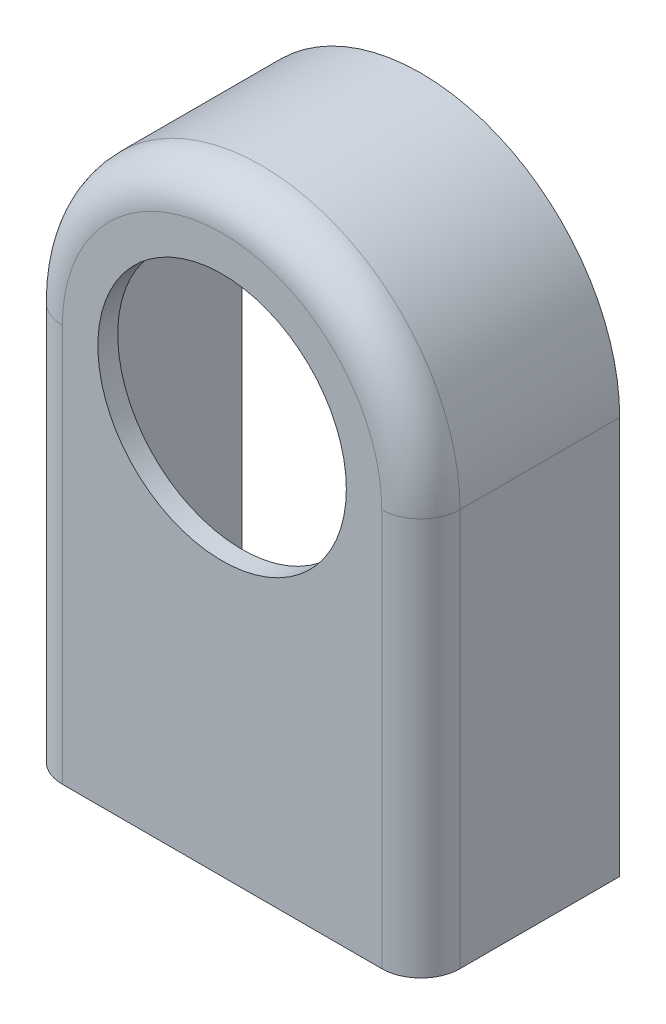
ISO-10303-21;
HEADER;
FILE_DESCRIPTION(('STEP AP214'),'2;1');
FILE_NAME('part.step','',(''),(''),'','','');
FILE_SCHEMA(('AUTOMOTIVE_DESIGN { 1 0 10303 214 1 1 1 1 }'));
ENDSEC;
DATA;
#1=APPLICATION_CONTEXT('core data for automotive mechanical design processes');
#2=APPLICATION_PROTOCOL_DEFINITION('international standard','automotive_design',2000,#1);
#3=PRODUCT_CONTEXT('',#1,'mechanical');
#4=PRODUCT('Part','Part','',(#3));
#5=PRODUCT_RELATED_PRODUCT_CATEGORY('part','',(#4));
#6=PRODUCT_DEFINITION_FORMATION('','',#4);
#7=PRODUCT_DEFINITION_CONTEXT('part definition',#1,'design');
#8=PRODUCT_DEFINITION('design','',#6,#7);
#9=PRODUCT_DEFINITION_SHAPE('','',#8);
#10=(LENGTH_UNIT() NAMED_UNIT(*) SI_UNIT(.MILLI.,.METRE.));
#11=(NAMED_UNIT(*) PLANE_ANGLE_UNIT() SI_UNIT($,.RADIAN.));
#12=(NAMED_UNIT(*) SI_UNIT($,.STERADIAN.) SOLID_ANGLE_UNIT());
#13=UNCERTAINTY_MEASURE_WITH_UNIT(LENGTH_MEASURE(1.E-05),#10,'distance_accuracy_value','');
#14=(GEOMETRIC_REPRESENTATION_CONTEXT(3) GLOBAL_UNCERTAINTY_ASSIGNED_CONTEXT((#13)) GLOBAL_UNIT_ASSIGNED_CONTEXT((#10,
#11,#12)) REPRESENTATION_CONTEXT('',''));
#15=CARTESIAN_POINT('',(0.,0.,0.));
#16=DIRECTION('',(0.,0.,1.));
#17=DIRECTION('',(1.,0.,0.));
#18=AXIS2_PLACEMENT_3D('',#15,#16,#17);
#19=CARTESIAN_POINT('',(0.,0.,50.8));
#20=DIRECTION('',(0.,0.,-1.));
#21=DIRECTION('',(-1.,0.,0.));
#22=AXIS2_PLACEMENT_3D('',#19,#20,#21);
#23=CYLINDRICAL_SURFACE('',#22,50.8);
#24=DIRECTION('',(0.,0.,-1.));
#25=VECTOR('',#24,1.);
#26=CARTESIAN_POINT('',(-50.8,0.,50.8));
#27=LINE('',#26,#25);
#28=CARTESIAN_POINT('',(-50.8,0.,40.8));
#29=VERTEX_POINT('',#28);
#30=CARTESIAN_POINT('',(-50.8,0.,0.));
#31=VERTEX_POINT('',#30);
#32=EDGE_CURVE('E201',#29,#31,#27,.T.);
#33=ORIENTED_EDGE('',*,*,#32,.F.);
#34=CARTESIAN_POINT('',(0.,0.,40.8));
#35=DIRECTION('',(0.,0.,1.));
#36=DIRECTION('',(1.,0.,0.));
#37=AXIS2_PLACEMENT_3D('',#34,#35,#36);
#38=CIRCLE('',#37,50.8);
#39=CARTESIAN_POINT('',(50.8,0.,40.8));
#40=VERTEX_POINT('',#39);
#41=EDGE_CURVE('E11',#29,#40,#38,.F.);
#42=ORIENTED_EDGE('',*,*,#41,.T.);
#43=DIRECTION('',(0.,0.,-1.));
#44=VECTOR('',#43,1.);
#45=CARTESIAN_POINT('',(50.8,0.,50.8));
#46=LINE('',#45,#44);
#47=CARTESIAN_POINT('',(50.8,0.,0.));
#48=VERTEX_POINT('',#47);
#49=EDGE_CURVE('E182',#40,#48,#46,.T.);
#50=ORIENTED_EDGE('',*,*,#49,.T.);
#51=CARTESIAN_POINT('',(0.,0.,0.));
#52=DIRECTION('',(0.,0.,1.));
#53=DIRECTION('',(1.,0.,0.));
#54=AXIS2_PLACEMENT_3D('',#51,#52,#53);
#55=CIRCLE('',#54,50.8);
#56=EDGE_CURVE('E184',#48,#31,#55,.T.);
#57=ORIENTED_EDGE('',*,*,#56,.T.);
#58=EDGE_LOOP('',(#33,#42,#50,#57));
#59=FACE_BOUND('',#58,.T.);
#60=ADVANCED_FACE('F36',(#59),#23,.T.);
#61=CARTESIAN_POINT('',(-50.8,0.,50.8));
#62=DIRECTION('',(1.,0.,0.));
#63=DIRECTION('',(0.,0.,-1.));
#64=AXIS2_PLACEMENT_3D('',#61,#62,#63);
#65=PLANE('',#64);
#66=DIRECTION('',(0.,0.,-1.));
#67=VECTOR('',#66,1.);
#68=CARTESIAN_POINT('',(-50.8,-101.6,50.8));
#69=LINE('',#68,#67);
#70=CARTESIAN_POINT('',(-50.8,-101.6,40.8));
#71=VERTEX_POINT('',#70);
#72=CARTESIAN_POINT('',(-50.8,-101.6,0.));
#73=VERTEX_POINT('',#72);
#74=EDGE_CURVE('E199',#71,#73,#69,.T.);
#75=ORIENTED_EDGE('',*,*,#74,.F.);
#76=DIRECTION('',(0.,-1.,0.));
#77=VECTOR('',#76,1.);
#78=CARTESIAN_POINT('',(-50.8,0.,40.8));
#79=LINE('',#78,#77);
#80=EDGE_CURVE('E45',#71,#29,#79,.F.);
#81=ORIENTED_EDGE('',*,*,#80,.T.);
#82=ORIENTED_EDGE('',*,*,#32,.T.);
#83=DIRECTION('',(0.,-1.,0.));
#84=VECTOR('',#83,1.);
#85=CARTESIAN_POINT('',(-50.8,0.,0.));
#86=LINE('',#85,#84);
#87=EDGE_CURVE('E187',#31,#73,#86,.T.);
#88=ORIENTED_EDGE('',*,*,#87,.T.);
#89=EDGE_LOOP('',(#75,#81,#82,#88));
#90=FACE_BOUND('',#89,.T.);
#91=ADVANCED_FACE('F245',(#90),#65,.F.);
#92=CARTESIAN_POINT('',(-50.8,-101.6,50.8));
#93=DIRECTION('',(0.,1.,0.));
#94=DIRECTION('',(0.,0.,1.));
#95=AXIS2_PLACEMENT_3D('',#92,#93,#94);
#96=PLANE('',#95);
#97=DIRECTION('',(0.,0.,-1.));
#98=VECTOR('',#97,1.);
#99=CARTESIAN_POINT('',(50.8,-101.6,50.8));
#100=LINE('',#99,#98);
#101=CARTESIAN_POINT('',(50.8,-101.6,40.8));
#102=VERTEX_POINT('',#101);
#103=CARTESIAN_POINT('',(50.8,-101.6,0.));
#104=VERTEX_POINT('',#103);
#105=EDGE_CURVE('E197',#102,#104,#100,.T.);
#106=ORIENTED_EDGE('',*,*,#105,.F.);
#107=CARTESIAN_POINT('',(40.8,-101.6,40.8));
#108=DIRECTION('',(0.,1.,0.));
#109=DIRECTION('',(0.,0.,1.));
#110=AXIS2_PLACEMENT_3D('',#107,#108,#109);
#111=CIRCLE('',#110,10.);
#112=CARTESIAN_POINT('',(40.8,-101.6,50.8));
#113=VERTEX_POINT('',#112);
#114=EDGE_CURVE('E214',#102,#113,#111,.F.);
#115=ORIENTED_EDGE('',*,*,#114,.T.);
#116=DIRECTION('',(1.,0.,0.));
#117=VECTOR('',#116,1.);
#118=CARTESIAN_POINT('',(-50.8,-101.6,50.8));
#119=LINE('',#118,#117);
#120=CARTESIAN_POINT('',(-40.8,-101.6,50.8));
#121=VERTEX_POINT('',#120);
#122=EDGE_CURVE('E179',#121,#113,#119,.T.);
#123=ORIENTED_EDGE('',*,*,#122,.F.);
#124=CARTESIAN_POINT('',(-40.8,-101.6,40.8));
#125=DIRECTION('',(0.,1.,0.));
#126=DIRECTION('',(0.,0.,1.));
#127=AXIS2_PLACEMENT_3D('',#124,#125,#126);
#128=CIRCLE('',#127,10.);
#129=EDGE_CURVE('E212',#121,#71,#128,.F.);
#130=ORIENTED_EDGE('',*,*,#129,.T.);
#131=ORIENTED_EDGE('',*,*,#74,.T.);
#132=DIRECTION('',(1.,0.,0.));
#133=VECTOR('',#132,1.);
#134=CARTESIAN_POINT('',(-50.8,-101.6,0.));
#135=LINE('',#134,#133);
#136=EDGE_CURVE('E191',#73,#104,#135,.T.);
#137=ORIENTED_EDGE('',*,*,#136,.T.);
#138=EDGE_LOOP('',(#106,#115,#123,#130,#131,#137));
#139=FACE_BOUND('',#138,.T.);
#140=ADVANCED_FACE('F233',(#139),#96,.F.);
#141=CARTESIAN_POINT('',(50.8,0.,50.8));
#142=DIRECTION('',(-1.,0.,0.));
#143=DIRECTION('',(0.,0.,1.));
#144=AXIS2_PLACEMENT_3D('',#141,#142,#143);
#145=PLANE('',#144);
#146=ORIENTED_EDGE('',*,*,#49,.F.);
#147=DIRECTION('',(0.,1.,0.));
#148=VECTOR('',#147,1.);
#149=CARTESIAN_POINT('',(50.8,-101.6,40.8));
#150=LINE('',#149,#148);
#151=EDGE_CURVE('E210',#40,#102,#150,.F.);
#152=ORIENTED_EDGE('',*,*,#151,.T.);
#153=ORIENTED_EDGE('',*,*,#105,.T.);
#154=DIRECTION('',(0.,1.,0.));
#155=VECTOR('',#154,1.);
#156=CARTESIAN_POINT('',(50.8,0.,0.));
#157=LINE('',#156,#155);
#158=EDGE_CURVE('E183',#104,#48,#157,.T.);
#159=ORIENTED_EDGE('',*,*,#158,.T.);
#160=EDGE_LOOP('',(#146,#152,#153,#159));
#161=FACE_BOUND('',#160,.T.);
#162=ADVANCED_FACE('F240',(#161),#145,.F.);
#163=CARTESIAN_POINT('',(0.,0.,50.8));
#164=DIRECTION('',(0.,0.,1.));
#165=DIRECTION('',(1.,0.,0.));
#166=AXIS2_PLACEMENT_3D('',#163,#164,#165);
#167=PLANE('',#166);
#168=CARTESIAN_POINT('',(0.,0.,50.8));
#169=DIRECTION('',(0.,0.,1.));
#170=DIRECTION('',(1.,0.,0.));
#171=AXIS2_PLACEMENT_3D('',#168,#169,#170);
#172=CIRCLE('',#171,31.75);
#173=CARTESIAN_POINT('',(31.75,0.,50.8));
#174=VERTEX_POINT('',#173);
#175=EDGE_CURVE('E165',#174,#174,#172,.T.);
#176=ORIENTED_EDGE('',*,*,#175,.F.);
#177=EDGE_LOOP('',(#176));
#178=FACE_BOUND('',#177,.T.);
#179=ORIENTED_EDGE('',*,*,#122,.T.);
#180=DIRECTION('',(0.,1.,0.));
#181=VECTOR('',#180,1.);
#182=CARTESIAN_POINT('',(40.8,0.,50.8));
#183=LINE('',#182,#181);
#184=CARTESIAN_POINT('',(40.8,0.,50.8));
#185=VERTEX_POINT('',#184);
#186=EDGE_CURVE('E207',#113,#185,#183,.T.);
#187=ORIENTED_EDGE('',*,*,#186,.T.);
#188=CARTESIAN_POINT('',(0.,0.,50.8));
#189=DIRECTION('',(0.,0.,1.));
#190=DIRECTION('',(1.,0.,0.));
#191=AXIS2_PLACEMENT_3D('',#188,#189,#190);
#192=CIRCLE('',#191,40.8);
#193=CARTESIAN_POINT('',(-40.8,0.,50.8));
#194=VERTEX_POINT('',#193);
#195=EDGE_CURVE('E203',#185,#194,#192,.T.);
#196=ORIENTED_EDGE('',*,*,#195,.T.);
#197=DIRECTION('',(0.,-1.,0.));
#198=VECTOR('',#197,1.);
#199=CARTESIAN_POINT('',(-40.8,-101.6,50.8));
#200=LINE('',#199,#198);
#201=EDGE_CURVE('E205',#194,#121,#200,.T.);
#202=ORIENTED_EDGE('',*,*,#201,.T.);
#203=EDGE_LOOP('',(#179,#187,#196,#202));
#204=FACE_BOUND('',#203,.T.);
#205=ADVANCED_FACE('F229',(#178,#204),#167,.T.);
#206=CARTESIAN_POINT('',(0.,0.,0.));
#207=DIRECTION('',(0.,0.,1.));
#208=DIRECTION('',(1.,0.,0.));
#209=AXIS2_PLACEMENT_3D('',#206,#207,#208);
#210=PLANE('',#209);
#211=DIRECTION('',(0.,1.,0.));
#212=VECTOR('',#211,1.);
#213=CARTESIAN_POINT('',(45.72,0.,0.));
#214=LINE('',#213,#212);
#215=CARTESIAN_POINT('',(45.72,-96.52,0.));
#216=VERTEX_POINT('',#215);
#217=CARTESIAN_POINT('',(45.72,0.,0.));
#218=VERTEX_POINT('',#217);
#219=EDGE_CURVE('E174',#216,#218,#214,.T.);
#220=ORIENTED_EDGE('',*,*,#219,.T.);
#221=CARTESIAN_POINT('',(0.,0.,0.));
#222=DIRECTION('',(0.,0.,1.));
#223=DIRECTION('',(1.,0.,0.));
#224=AXIS2_PLACEMENT_3D('',#221,#222,#223);
#225=CIRCLE('',#224,45.72);
#226=CARTESIAN_POINT('',(-45.72,0.,0.));
#227=VERTEX_POINT('',#226);
#228=EDGE_CURVE('E144',#218,#227,#225,.T.);
#229=ORIENTED_EDGE('',*,*,#228,.T.);
#230=DIRECTION('',(0.,-1.,0.));
#231=VECTOR('',#230,1.);
#232=CARTESIAN_POINT('',(-45.72,0.,0.));
#233=LINE('',#232,#231);
#234=CARTESIAN_POINT('',(-45.72,-96.52,0.));
#235=VERTEX_POINT('',#234);
#236=EDGE_CURVE('E173',#227,#235,#233,.T.);
#237=ORIENTED_EDGE('',*,*,#236,.T.);
#238=DIRECTION('',(1.,0.,0.));
#239=VECTOR('',#238,1.);
#240=CARTESIAN_POINT('',(-50.8,-96.52,0.));
#241=LINE('',#240,#239);
#242=EDGE_CURVE('E53',#235,#216,#241,.T.);
#243=ORIENTED_EDGE('',*,*,#242,.T.);
#244=EDGE_LOOP('',(#220,#229,#237,#243));
#245=FACE_BOUND('',#244,.T.);
#246=ORIENTED_EDGE('',*,*,#56,.F.);
#247=ORIENTED_EDGE('',*,*,#158,.F.);
#248=ORIENTED_EDGE('',*,*,#136,.F.);
#249=ORIENTED_EDGE('',*,*,#87,.F.);
#250=EDGE_LOOP('',(#246,#247,#248,#249));
#251=FACE_BOUND('',#250,.T.);
#252=ADVANCED_FACE('F248',(#245,#251),#210,.F.);
#253=CARTESIAN_POINT('',(-40.8,0.,40.8));
#254=DIRECTION('',(0.,1.,0.));
#255=DIRECTION('',(0.,0.,1.));
#256=AXIS2_PLACEMENT_3D('',#253,#254,#255);
#257=CYLINDRICAL_SURFACE('',#256,10.);
#258=ORIENTED_EDGE('',*,*,#129,.F.);
#259=ORIENTED_EDGE('',*,*,#201,.F.);
#260=CARTESIAN_POINT('',(-40.8,0.,40.8));
#261=DIRECTION('',(0.,1.,0.));
#262=DIRECTION('',(0.,0.,1.));
#263=AXIS2_PLACEMENT_3D('',#260,#261,#262);
#264=CIRCLE('',#263,10.);
#265=EDGE_CURVE('E188',#29,#194,#264,.T.);
#266=ORIENTED_EDGE('',*,*,#265,.F.);
#267=ORIENTED_EDGE('',*,*,#80,.F.);
#268=EDGE_LOOP('',(#258,#259,#266,#267));
#269=FACE_BOUND('',#268,.T.);
#270=ADVANCED_FACE('F38',(#269),#257,.T.);
#271=CARTESIAN_POINT('',(0.,0.,40.8));
#272=DIRECTION('',(0.,0.,1.));
#273=DIRECTION('',(1.,0.,0.));
#274=AXIS2_PLACEMENT_3D('',#271,#272,#273);
#275=TOROIDAL_SURFACE('',#274,40.8,10.);
#276=ORIENTED_EDGE('',*,*,#265,.T.);
#277=ORIENTED_EDGE('',*,*,#195,.F.);
#278=CARTESIAN_POINT('',(40.8,0.,40.8));
#279=DIRECTION('',(0.,-1.,0.));
#280=DIRECTION('',(0.,0.,-1.));
#281=AXIS2_PLACEMENT_3D('',#278,#279,#280);
#282=CIRCLE('',#281,10.);
#283=EDGE_CURVE('E136',#40,#185,#282,.T.);
#284=ORIENTED_EDGE('',*,*,#283,.F.);
#285=ORIENTED_EDGE('',*,*,#41,.F.);
#286=EDGE_LOOP('',(#276,#277,#284,#285));
#287=FACE_BOUND('',#286,.T.);
#288=ADVANCED_FACE('F222',(#287),#275,.T.);
#289=CARTESIAN_POINT('',(40.8,0.,40.8));
#290=DIRECTION('',(0.,-1.,0.));
#291=DIRECTION('',(0.,0.,-1.));
#292=AXIS2_PLACEMENT_3D('',#289,#290,#291);
#293=CYLINDRICAL_SURFACE('',#292,10.);
#294=ORIENTED_EDGE('',*,*,#114,.F.);
#295=ORIENTED_EDGE('',*,*,#151,.F.);
#296=ORIENTED_EDGE('',*,*,#283,.T.);
#297=ORIENTED_EDGE('',*,*,#186,.F.);
#298=EDGE_LOOP('',(#294,#295,#296,#297));
#299=FACE_BOUND('',#298,.T.);
#300=ADVANCED_FACE('F237',(#299),#293,.T.);
#301=CARTESIAN_POINT('',(0.,0.,50.8));
#302=DIRECTION('',(0.,0.,-1.));
#303=DIRECTION('',(-1.,0.,0.));
#304=AXIS2_PLACEMENT_3D('',#301,#302,#303);
#305=CYLINDRICAL_SURFACE('',#304,45.72);
#306=DIRECTION('',(0.,0.,-1.));
#307=VECTOR('',#306,1.);
#308=CARTESIAN_POINT('',(-45.72,0.,50.8));
#309=LINE('',#308,#307);
#310=CARTESIAN_POINT('',(-45.72,0.,40.8));
#311=VERTEX_POINT('',#310);
#312=EDGE_CURVE('E420',#311,#227,#309,.T.);
#313=ORIENTED_EDGE('',*,*,#312,.T.);
#314=ORIENTED_EDGE('',*,*,#228,.F.);
#315=DIRECTION('',(0.,0.,-1.));
#316=VECTOR('',#315,1.);
#317=CARTESIAN_POINT('',(45.72,0.,50.8));
#318=LINE('',#317,#316);
#319=CARTESIAN_POINT('',(45.72,0.,40.8));
#320=VERTEX_POINT('',#319);
#321=EDGE_CURVE('E140',#320,#218,#318,.T.);
#322=ORIENTED_EDGE('',*,*,#321,.F.);
#323=CARTESIAN_POINT('',(0.,0.,40.8));
#324=DIRECTION('',(0.,0.,-1.));
#325=DIRECTION('',(-1.,0.,0.));
#326=AXIS2_PLACEMENT_3D('',#323,#324,#325);
#327=CIRCLE('',#326,45.72);
#328=EDGE_CURVE('E127',#311,#320,#327,.T.);
#329=ORIENTED_EDGE('',*,*,#328,.F.);
#330=EDGE_LOOP('',(#313,#314,#322,#329));
#331=FACE_BOUND('',#330,.T.);
#332=ADVANCED_FACE('F142',(#331),#305,.F.);
#333=CARTESIAN_POINT('',(-45.72,0.,50.8));
#334=DIRECTION('',(1.,0.,0.));
#335=DIRECTION('',(0.,0.,-1.));
#336=AXIS2_PLACEMENT_3D('',#333,#334,#335);
#337=PLANE('',#336);
#338=DIRECTION('',(0.,0.,-1.));
#339=VECTOR('',#338,1.);
#340=CARTESIAN_POINT('',(-45.72,-96.52,50.8));
#341=LINE('',#340,#339);
#342=CARTESIAN_POINT('',(-45.72,-96.52,40.8));
#343=VERTEX_POINT('',#342);
#344=EDGE_CURVE('E412',#343,#235,#341,.T.);
#345=ORIENTED_EDGE('',*,*,#344,.T.);
#346=ORIENTED_EDGE('',*,*,#236,.F.);
#347=ORIENTED_EDGE('',*,*,#312,.F.);
#348=DIRECTION('',(0.,1.,0.));
#349=VECTOR('',#348,1.);
#350=CARTESIAN_POINT('',(-45.72,0.,40.8));
#351=LINE('',#350,#349);
#352=EDGE_CURVE('E137',#343,#311,#351,.T.);
#353=ORIENTED_EDGE('',*,*,#352,.F.);
#354=EDGE_LOOP('',(#345,#346,#347,#353));
#355=FACE_BOUND('',#354,.T.);
#356=ADVANCED_FACE('F283',(#355),#337,.T.);
#357=CARTESIAN_POINT('',(-50.8,-96.52,50.8));
#358=DIRECTION('',(0.,1.,0.));
#359=DIRECTION('',(0.,0.,1.));
#360=AXIS2_PLACEMENT_3D('',#357,#358,#359);
#361=PLANE('',#360);
#362=DIRECTION('',(0.,0.,-1.));
#363=VECTOR('',#362,1.);
#364=CARTESIAN_POINT('',(45.72,-96.52,50.8));
#365=LINE('',#364,#363);
#366=CARTESIAN_POINT('',(45.72,-96.52,40.8));
#367=VERTEX_POINT('',#366);
#368=EDGE_CURVE('E148',#367,#216,#365,.T.);
#369=ORIENTED_EDGE('',*,*,#368,.T.);
#370=ORIENTED_EDGE('',*,*,#242,.F.);
#371=ORIENTED_EDGE('',*,*,#344,.F.);
#372=CARTESIAN_POINT('',(-40.8,-96.52,40.8));
#373=DIRECTION('',(0.,1.,0.));
#374=DIRECTION('',(0.,0.,1.));
#375=AXIS2_PLACEMENT_3D('',#372,#373,#374);
#376=CIRCLE('',#375,4.92);
#377=CARTESIAN_POINT('',(-40.8,-96.52,45.72));
#378=VERTEX_POINT('',#377);
#379=EDGE_CURVE('E156',#378,#343,#376,.F.);
#380=ORIENTED_EDGE('',*,*,#379,.F.);
#381=DIRECTION('',(1.,0.,0.));
#382=VECTOR('',#381,1.);
#383=CARTESIAN_POINT('',(-50.8,-96.52,45.72));
#384=LINE('',#383,#382);
#385=CARTESIAN_POINT('',(40.8,-96.52,45.72));
#386=VERTEX_POINT('',#385);
#387=EDGE_CURVE('E149',#378,#386,#384,.T.);
#388=ORIENTED_EDGE('',*,*,#387,.T.);
#389=CARTESIAN_POINT('',(40.8,-96.52,40.8));
#390=DIRECTION('',(0.,1.,0.));
#391=DIRECTION('',(0.,0.,1.));
#392=AXIS2_PLACEMENT_3D('',#389,#390,#391);
#393=CIRCLE('',#392,4.92);
#394=EDGE_CURVE('E414',#367,#386,#393,.F.);
#395=ORIENTED_EDGE('',*,*,#394,.F.);
#396=EDGE_LOOP('',(#369,#370,#371,#380,#388,#395));
#397=FACE_BOUND('',#396,.T.);
#398=ADVANCED_FACE('F290',(#397),#361,.T.);
#399=CARTESIAN_POINT('',(45.72,0.,50.8));
#400=DIRECTION('',(-1.,0.,0.));
#401=DIRECTION('',(0.,0.,1.));
#402=AXIS2_PLACEMENT_3D('',#399,#400,#401);
#403=PLANE('',#402);
#404=ORIENTED_EDGE('',*,*,#321,.T.);
#405=ORIENTED_EDGE('',*,*,#219,.F.);
#406=ORIENTED_EDGE('',*,*,#368,.F.);
#407=DIRECTION('',(0.,1.,0.));
#408=VECTOR('',#407,1.);
#409=CARTESIAN_POINT('',(45.72,0.,40.8));
#410=LINE('',#409,#408);
#411=EDGE_CURVE('E152',#320,#367,#410,.F.);
#412=ORIENTED_EDGE('',*,*,#411,.F.);
#413=EDGE_LOOP('',(#404,#405,#406,#412));
#414=FACE_BOUND('',#413,.T.);
#415=ADVANCED_FACE('F153',(#414),#403,.T.);
#416=CARTESIAN_POINT('',(0.,0.,45.72));
#417=DIRECTION('',(0.,0.,1.));
#418=DIRECTION('',(1.,0.,0.));
#419=AXIS2_PLACEMENT_3D('',#416,#417,#418);
#420=PLANE('',#419);
#421=CARTESIAN_POINT('',(0.,0.,45.72));
#422=DIRECTION('',(0.,0.,1.));
#423=DIRECTION('',(1.,0.,0.));
#424=AXIS2_PLACEMENT_3D('',#421,#422,#423);
#425=CIRCLE('',#424,31.75);
#426=CARTESIAN_POINT('',(31.75,0.,45.72));
#427=VERTEX_POINT('',#426);
#428=EDGE_CURVE('E40',#427,#427,#425,.T.);
#429=ORIENTED_EDGE('',*,*,#428,.T.);
#430=EDGE_LOOP('',(#429));
#431=FACE_BOUND('',#430,.T.);
#432=ORIENTED_EDGE('',*,*,#387,.F.);
#433=DIRECTION('',(0.,1.,0.));
#434=VECTOR('',#433,1.);
#435=CARTESIAN_POINT('',(-40.8,0.,45.72));
#436=LINE('',#435,#434);
#437=CARTESIAN_POINT('',(-40.8,0.,45.72));
#438=VERTEX_POINT('',#437);
#439=EDGE_CURVE('E170',#438,#378,#436,.F.);
#440=ORIENTED_EDGE('',*,*,#439,.F.);
#441=CARTESIAN_POINT('',(0.,0.,45.72));
#442=DIRECTION('',(0.,0.,1.));
#443=DIRECTION('',(1.,0.,0.));
#444=AXIS2_PLACEMENT_3D('',#441,#442,#443);
#445=CIRCLE('',#444,40.8);
#446=CARTESIAN_POINT('',(40.8,0.,45.72));
#447=VERTEX_POINT('',#446);
#448=EDGE_CURVE('E168',#447,#438,#445,.T.);
#449=ORIENTED_EDGE('',*,*,#448,.F.);
#450=DIRECTION('',(0.,1.,0.));
#451=VECTOR('',#450,1.);
#452=CARTESIAN_POINT('',(40.8,0.,45.72));
#453=LINE('',#452,#451);
#454=EDGE_CURVE('E157',#386,#447,#453,.T.);
#455=ORIENTED_EDGE('',*,*,#454,.F.);
#456=EDGE_LOOP('',(#432,#440,#449,#455));
#457=FACE_BOUND('',#456,.T.);
#458=ADVANCED_FACE('F304',(#431,#457),#420,.F.);
#459=CARTESIAN_POINT('',(-40.8,0.,40.8));
#460=DIRECTION('',(0.,1.,0.));
#461=DIRECTION('',(0.,0.,1.));
#462=AXIS2_PLACEMENT_3D('',#459,#460,#461);
#463=CYLINDRICAL_SURFACE('',#462,4.92);
#464=ORIENTED_EDGE('',*,*,#379,.T.);
#465=ORIENTED_EDGE('',*,*,#352,.T.);
#466=CARTESIAN_POINT('',(-40.8,0.,40.8));
#467=DIRECTION('',(0.,1.,0.));
#468=DIRECTION('',(-1.,0.,0.));
#469=AXIS2_PLACEMENT_3D('',#466,#467,#468);
#470=CIRCLE('',#469,4.92);
#471=EDGE_CURVE('E134',#311,#438,#470,.T.);
#472=ORIENTED_EDGE('',*,*,#471,.T.);
#473=ORIENTED_EDGE('',*,*,#439,.T.);
#474=EDGE_LOOP('',(#464,#465,#472,#473));
#475=FACE_BOUND('',#474,.T.);
#476=ADVANCED_FACE('F312',(#475),#463,.F.);
#477=CARTESIAN_POINT('',(0.,0.,40.8));
#478=DIRECTION('',(0.,0.,1.));
#479=DIRECTION('',(1.,0.,0.));
#480=AXIS2_PLACEMENT_3D('',#477,#478,#479);
#481=TOROIDAL_SURFACE('',#480,40.8,4.92);
#482=ORIENTED_EDGE('',*,*,#471,.F.);
#483=ORIENTED_EDGE('',*,*,#328,.T.);
#484=CARTESIAN_POINT('',(40.8,0.,40.8));
#485=DIRECTION('',(0.,-1.,0.));
#486=DIRECTION('',(0.,0.,-1.));
#487=AXIS2_PLACEMENT_3D('',#484,#485,#486);
#488=CIRCLE('',#487,4.92);
#489=EDGE_CURVE('E131',#320,#447,#488,.T.);
#490=ORIENTED_EDGE('',*,*,#489,.T.);
#491=ORIENTED_EDGE('',*,*,#448,.T.);
#492=EDGE_LOOP('',(#482,#483,#490,#491));
#493=FACE_BOUND('',#492,.T.);
#494=ADVANCED_FACE('F129',(#493),#481,.F.);
#495=CARTESIAN_POINT('',(40.8,0.,40.8));
#496=DIRECTION('',(0.,-1.,0.));
#497=DIRECTION('',(0.,0.,-1.));
#498=AXIS2_PLACEMENT_3D('',#495,#496,#497);
#499=CYLINDRICAL_SURFACE('',#498,4.92);
#500=ORIENTED_EDGE('',*,*,#394,.T.);
#501=ORIENTED_EDGE('',*,*,#454,.T.);
#502=ORIENTED_EDGE('',*,*,#489,.F.);
#503=ORIENTED_EDGE('',*,*,#411,.T.);
#504=EDGE_LOOP('',(#500,#501,#502,#503));
#505=FACE_BOUND('',#504,.T.);
#506=ADVANCED_FACE('F160',(#505),#499,.F.);
#507=CARTESIAN_POINT('',(0.,0.,0.));
#508=DIRECTION('',(0.,0.,1.));
#509=DIRECTION('',(1.,0.,0.));
#510=AXIS2_PLACEMENT_3D('',#507,#508,#509);
#511=CYLINDRICAL_SURFACE('',#510,31.75);
#512=ORIENTED_EDGE('',*,*,#175,.T.);
#513=EDGE_LOOP('',(#512));
#514=FACE_BOUND('',#513,.T.);
#515=ORIENTED_EDGE('',*,*,#428,.F.);
#516=EDGE_LOOP('',(#515));
#517=FACE_BOUND('',#516,.T.);
#518=ADVANCED_FACE('F334',(#514,#517),#511,.F.);
#519=CLOSED_SHELL('',(#60,#91,#140,#162,#205,#252,#270,#288,#300,#332,#356,#398,#415,#458,#476,
#494,#506,#518));
#520=MANIFOLD_SOLID_BREP('B2',#519);
#521=ADVANCED_BREP_SHAPE_REPRESENTATION('',(#18,#520),#14);
#522=SHAPE_DEFINITION_REPRESENTATION(#9,#521);
ENDSEC;
END-ISO-10303-21;
